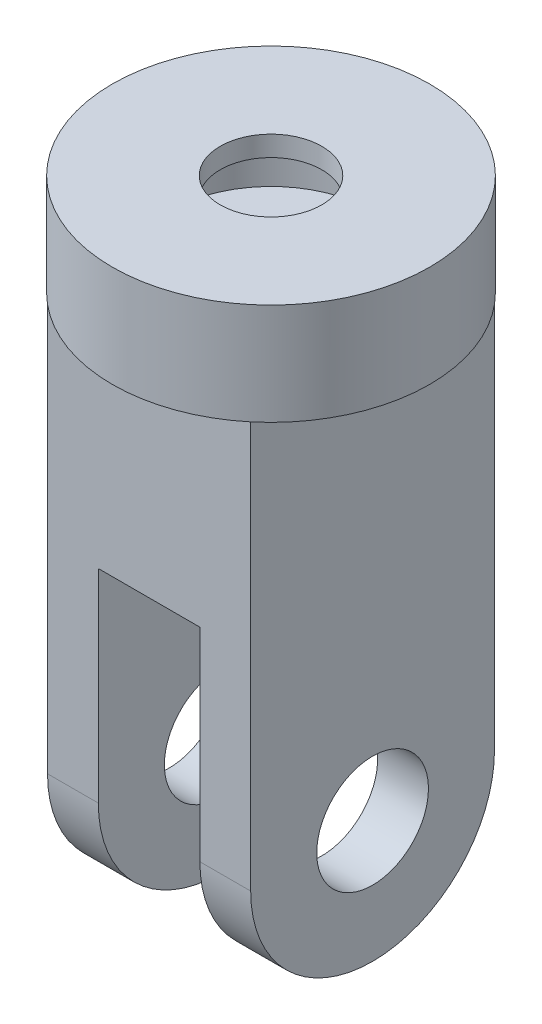
ISO-10303-21;
HEADER;
FILE_DESCRIPTION(('STEP AP214'),'2;1');
FILE_NAME('part.step','',(''),(''),'','','');
FILE_SCHEMA(('AUTOMOTIVE_DESIGN { 1 0 10303 214 1 1 1 1 }'));
ENDSEC;
DATA;
#1=APPLICATION_CONTEXT('core data for automotive mechanical design processes');
#2=APPLICATION_PROTOCOL_DEFINITION('international standard','automotive_design',2000,#1);
#3=PRODUCT_CONTEXT('',#1,'mechanical');
#4=PRODUCT('Part','Part','',(#3));
#5=PRODUCT_RELATED_PRODUCT_CATEGORY('part','',(#4));
#6=PRODUCT_DEFINITION_FORMATION('','',#4);
#7=PRODUCT_DEFINITION_CONTEXT('part definition',#1,'design');
#8=PRODUCT_DEFINITION('design','',#6,#7);
#9=PRODUCT_DEFINITION_SHAPE('','',#8);
#10=(LENGTH_UNIT() NAMED_UNIT(*) SI_UNIT(.MILLI.,.METRE.));
#11=(NAMED_UNIT(*) PLANE_ANGLE_UNIT() SI_UNIT($,.RADIAN.));
#12=(NAMED_UNIT(*) SI_UNIT($,.STERADIAN.) SOLID_ANGLE_UNIT());
#13=UNCERTAINTY_MEASURE_WITH_UNIT(LENGTH_MEASURE(1.E-05),#10,'distance_accuracy_value','');
#14=(GEOMETRIC_REPRESENTATION_CONTEXT(3) GLOBAL_UNCERTAINTY_ASSIGNED_CONTEXT((#13)) GLOBAL_UNIT_ASSIGNED_CONTEXT((#10,
#11,#12)) REPRESENTATION_CONTEXT('',''));
#15=CARTESIAN_POINT('',(0.,0.,0.));
#16=DIRECTION('',(0.,0.,1.));
#17=DIRECTION('',(1.,0.,0.));
#18=AXIS2_PLACEMENT_3D('',#15,#16,#17);
#19=CARTESIAN_POINT('',(10.,0.,0.));
#20=DIRECTION('',(-1.,0.,0.));
#21=DIRECTION('',(0.,0.,1.));
#22=AXIS2_PLACEMENT_3D('',#19,#20,#21);
#23=CYLINDRICAL_SURFACE('',#22,6.);
#24=CARTESIAN_POINT('',(2.5,0.,0.));
#25=DIRECTION('',(1.,0.,0.));
#26=DIRECTION('',(0.,1.,0.));
#27=AXIS2_PLACEMENT_3D('',#24,#25,#26);
#28=CIRCLE('',#27,6.);
#29=CARTESIAN_POINT('',(2.5,0.,6.));
#30=VERTEX_POINT('',#29);
#31=CARTESIAN_POINT('',(2.5,0.,-6.));
#32=VERTEX_POINT('',#31);
#33=EDGE_CURVE('E143',#30,#32,#28,.T.);
#34=ORIENTED_EDGE('',*,*,#33,.F.);
#35=DIRECTION('',(-1.,0.,0.));
#36=VECTOR('',#35,1.);
#37=CARTESIAN_POINT('',(10.,0.,6.));
#38=LINE('',#37,#36);
#39=CARTESIAN_POINT('',(0.,0.,6.));
#40=VERTEX_POINT('',#39);
#41=EDGE_CURVE('E82',#30,#40,#38,.T.);
#42=ORIENTED_EDGE('',*,*,#41,.T.);
#43=CARTESIAN_POINT('',(0.,0.,0.));
#44=DIRECTION('',(1.,0.,0.));
#45=DIRECTION('',(0.,0.,-1.));
#46=AXIS2_PLACEMENT_3D('',#43,#44,#45);
#47=CIRCLE('',#46,6.);
#48=CARTESIAN_POINT('',(0.,0.,-6.));
#49=VERTEX_POINT('',#48);
#50=EDGE_CURVE('E166',#40,#49,#47,.T.);
#51=ORIENTED_EDGE('',*,*,#50,.T.);
#52=DIRECTION('',(-1.,0.,0.));
#53=VECTOR('',#52,1.);
#54=CARTESIAN_POINT('',(10.,0.,-6.));
#55=LINE('',#54,#53);
#56=EDGE_CURVE('E192',#32,#49,#55,.T.);
#57=ORIENTED_EDGE('',*,*,#56,.F.);
#58=EDGE_LOOP('',(#34,#42,#51,#57));
#59=FACE_BOUND('',#58,.T.);
#60=ADVANCED_FACE('F39',(#59),#23,.T.);
#61=CARTESIAN_POINT('',(10.,20.,-6.));
#62=DIRECTION('',(0.,0.,1.));
#63=DIRECTION('',(0.,-1.,0.));
#64=AXIS2_PLACEMENT_3D('',#61,#62,#63);
#65=PLANE('',#64);
#66=DIRECTION('',(0.,1.,0.));
#67=VECTOR('',#66,1.);
#68=CARTESIAN_POINT('',(2.5,20.,-6.));
#69=LINE('',#68,#67);
#70=CARTESIAN_POINT('',(2.5,10.,-6.));
#71=VERTEX_POINT('',#70);
#72=EDGE_CURVE('E121',#32,#71,#69,.T.);
#73=ORIENTED_EDGE('',*,*,#72,.F.);
#74=ORIENTED_EDGE('',*,*,#56,.T.);
#75=DIRECTION('',(0.,1.,0.));
#76=VECTOR('',#75,1.);
#77=CARTESIAN_POINT('',(0.,20.,-6.));
#78=LINE('',#77,#76);
#79=CARTESIAN_POINT('',(0.,20.,-6.));
#80=VERTEX_POINT('',#79);
#81=EDGE_CURVE('E177',#49,#80,#78,.T.);
#82=ORIENTED_EDGE('',*,*,#81,.T.);
#83=DIRECTION('',(-1.,0.,0.));
#84=VECTOR('',#83,1.);
#85=CARTESIAN_POINT('',(10.,20.,-6.));
#86=LINE('',#85,#84);
#87=CARTESIAN_POINT('',(10.,20.,-6.));
#88=VERTEX_POINT('',#87);
#89=EDGE_CURVE('E189',#88,#80,#86,.T.);
#90=ORIENTED_EDGE('',*,*,#89,.F.);
#91=DIRECTION('',(0.,1.,0.));
#92=VECTOR('',#91,1.);
#93=CARTESIAN_POINT('',(10.,20.,-6.));
#94=LINE('',#93,#92);
#95=CARTESIAN_POINT('',(10.,0.,-6.));
#96=VERTEX_POINT('',#95);
#97=EDGE_CURVE('E90',#96,#88,#94,.T.);
#98=ORIENTED_EDGE('',*,*,#97,.F.);
#99=CARTESIAN_POINT('',(7.5,0.,-6.));
#100=VERTEX_POINT('',#99);
#101=EDGE_CURVE('E133',#96,#100,#55,.T.);
#102=ORIENTED_EDGE('',*,*,#101,.T.);
#103=DIRECTION('',(0.,1.,0.));
#104=VECTOR('',#103,1.);
#105=CARTESIAN_POINT('',(7.5,20.,-6.));
#106=LINE('',#105,#104);
#107=CARTESIAN_POINT('',(7.5,10.,-6.));
#108=VERTEX_POINT('',#107);
#109=EDGE_CURVE('E125',#100,#108,#106,.T.);
#110=ORIENTED_EDGE('',*,*,#109,.T.);
#111=DIRECTION('',(-1.,0.,0.));
#112=VECTOR('',#111,1.);
#113=CARTESIAN_POINT('',(10.,10.,-6.));
#114=LINE('',#113,#112);
#115=EDGE_CURVE('E114',#108,#71,#114,.T.);
#116=ORIENTED_EDGE('',*,*,#115,.T.);
#117=EDGE_LOOP('',(#73,#74,#82,#90,#98,#102,#110,#116));
#118=FACE_BOUND('',#117,.T.);
#119=ADVANCED_FACE('F131',(#118),#65,.F.);
#120=CARTESIAN_POINT('',(10.,0.,6.));
#121=DIRECTION('',(0.,0.,-1.));
#122=DIRECTION('',(0.,1.,0.));
#123=AXIS2_PLACEMENT_3D('',#120,#121,#122);
#124=PLANE('',#123);
#125=DIRECTION('',(0.,-1.,0.));
#126=VECTOR('',#125,1.);
#127=CARTESIAN_POINT('',(2.5,0.,6.));
#128=LINE('',#127,#126);
#129=CARTESIAN_POINT('',(2.5,10.,6.));
#130=VERTEX_POINT('',#129);
#131=EDGE_CURVE('E138',#130,#30,#128,.T.);
#132=ORIENTED_EDGE('',*,*,#131,.F.);
#133=DIRECTION('',(1.,0.,0.));
#134=VECTOR('',#133,1.);
#135=CARTESIAN_POINT('',(10.,10.,6.));
#136=LINE('',#135,#134);
#137=CARTESIAN_POINT('',(7.5,10.,6.));
#138=VERTEX_POINT('',#137);
#139=EDGE_CURVE('E11',#130,#138,#136,.T.);
#140=ORIENTED_EDGE('',*,*,#139,.T.);
#141=DIRECTION('',(0.,-1.,0.));
#142=VECTOR('',#141,1.);
#143=CARTESIAN_POINT('',(7.5,0.,6.));
#144=LINE('',#143,#142);
#145=CARTESIAN_POINT('',(7.5,0.,6.));
#146=VERTEX_POINT('',#145);
#147=EDGE_CURVE('E128',#138,#146,#144,.T.);
#148=ORIENTED_EDGE('',*,*,#147,.T.);
#149=CARTESIAN_POINT('',(10.,0.,6.));
#150=VERTEX_POINT('',#149);
#151=EDGE_CURVE('E184',#150,#146,#38,.T.);
#152=ORIENTED_EDGE('',*,*,#151,.F.);
#153=DIRECTION('',(0.,-1.,0.));
#154=VECTOR('',#153,1.);
#155=CARTESIAN_POINT('',(10.,0.,6.));
#156=LINE('',#155,#154);
#157=CARTESIAN_POINT('',(10.,20.,6.));
#158=VERTEX_POINT('',#157);
#159=EDGE_CURVE('E63',#158,#150,#156,.T.);
#160=ORIENTED_EDGE('',*,*,#159,.F.);
#161=DIRECTION('',(-1.,0.,0.));
#162=VECTOR('',#161,1.);
#163=CARTESIAN_POINT('',(10.,20.,6.));
#164=LINE('',#163,#162);
#165=CARTESIAN_POINT('',(0.,20.,6.));
#166=VERTEX_POINT('',#165);
#167=EDGE_CURVE('E187',#158,#166,#164,.T.);
#168=ORIENTED_EDGE('',*,*,#167,.T.);
#169=DIRECTION('',(0.,-1.,0.));
#170=VECTOR('',#169,1.);
#171=CARTESIAN_POINT('',(0.,0.,6.));
#172=LINE('',#171,#170);
#173=EDGE_CURVE('E171',#166,#40,#172,.T.);
#174=ORIENTED_EDGE('',*,*,#173,.T.);
#175=ORIENTED_EDGE('',*,*,#41,.F.);
#176=EDGE_LOOP('',(#132,#140,#148,#152,#160,#168,#174,#175));
#177=FACE_BOUND('',#176,.T.);
#178=ADVANCED_FACE('F202',(#177),#124,.F.);
#179=CARTESIAN_POINT('',(10.,0.,0.));
#180=DIRECTION('',(-1.,0.,0.));
#181=DIRECTION('',(0.,0.,1.));
#182=AXIS2_PLACEMENT_3D('',#179,#180,#181);
#183=CYLINDRICAL_SURFACE('',#182,2.75);
#184=CARTESIAN_POINT('',(0.,0.,0.));
#185=DIRECTION('',(1.,0.,0.));
#186=DIRECTION('',(0.,0.,-1.));
#187=AXIS2_PLACEMENT_3D('',#184,#185,#186);
#188=CIRCLE('',#187,2.75);
#189=CARTESIAN_POINT('',(0.,0.,-2.75));
#190=VERTEX_POINT('',#189);
#191=EDGE_CURVE('E158',#190,#190,#188,.T.);
#192=ORIENTED_EDGE('',*,*,#191,.F.);
#193=EDGE_LOOP('',(#192));
#194=FACE_BOUND('',#193,.T.);
#195=CARTESIAN_POINT('',(2.5,0.,0.));
#196=DIRECTION('',(1.,0.,0.));
#197=DIRECTION('',(0.,1.,0.));
#198=AXIS2_PLACEMENT_3D('',#195,#196,#197);
#199=CIRCLE('',#198,2.75);
#200=CARTESIAN_POINT('',(2.5,2.75,0.));
#201=VERTEX_POINT('',#200);
#202=EDGE_CURVE('E134',#201,#201,#199,.T.);
#203=ORIENTED_EDGE('',*,*,#202,.T.);
#204=EDGE_LOOP('',(#203));
#205=FACE_BOUND('',#204,.T.);
#206=ADVANCED_FACE('F258',(#194,#205),#183,.F.);
#207=CARTESIAN_POINT('',(10.,0.,0.));
#208=DIRECTION('',(1.,0.,0.));
#209=DIRECTION('',(0.,0.,-1.));
#210=AXIS2_PLACEMENT_3D('',#207,#208,#209);
#211=PLANE('',#210);
#212=CARTESIAN_POINT('',(10.,0.,0.));
#213=DIRECTION('',(1.,0.,0.));
#214=DIRECTION('',(0.,0.,-1.));
#215=AXIS2_PLACEMENT_3D('',#212,#213,#214);
#216=CIRCLE('',#215,6.);
#217=EDGE_CURVE('E169',#150,#96,#216,.T.);
#218=ORIENTED_EDGE('',*,*,#217,.T.);
#219=ORIENTED_EDGE('',*,*,#97,.T.);
#220=DIRECTION('',(0.,0.,1.));
#221=VECTOR('',#220,1.);
#222=CARTESIAN_POINT('',(10.,20.,6.));
#223=LINE('',#222,#221);
#224=EDGE_CURVE('E173',#88,#158,#223,.T.);
#225=ORIENTED_EDGE('',*,*,#224,.T.);
#226=ORIENTED_EDGE('',*,*,#159,.T.);
#227=EDGE_LOOP('',(#218,#219,#225,#226));
#228=FACE_BOUND('',#227,.T.);
#229=CARTESIAN_POINT('',(10.,0.,0.));
#230=DIRECTION('',(1.,0.,0.));
#231=DIRECTION('',(0.,0.,-1.));
#232=AXIS2_PLACEMENT_3D('',#229,#230,#231);
#233=CIRCLE('',#232,2.75);
#234=CARTESIAN_POINT('',(10.,0.,-2.75));
#235=VERTEX_POINT('',#234);
#236=EDGE_CURVE('E163',#235,#235,#233,.T.);
#237=ORIENTED_EDGE('',*,*,#236,.F.);
#238=EDGE_LOOP('',(#237));
#239=FACE_BOUND('',#238,.T.);
#240=ADVANCED_FACE('F205',(#228,#239),#211,.T.);
#241=CARTESIAN_POINT('',(0.,0.,0.));
#242=DIRECTION('',(1.,0.,0.));
#243=DIRECTION('',(0.,0.,-1.));
#244=AXIS2_PLACEMENT_3D('',#241,#242,#243);
#245=PLANE('',#244);
#246=ORIENTED_EDGE('',*,*,#50,.F.);
#247=ORIENTED_EDGE('',*,*,#173,.F.);
#248=DIRECTION('',(0.,0.,1.));
#249=VECTOR('',#248,1.);
#250=CARTESIAN_POINT('',(0.,20.,6.));
#251=LINE('',#250,#249);
#252=EDGE_CURVE('E180',#80,#166,#251,.T.);
#253=ORIENTED_EDGE('',*,*,#252,.F.);
#254=ORIENTED_EDGE('',*,*,#81,.F.);
#255=EDGE_LOOP('',(#246,#247,#253,#254));
#256=FACE_BOUND('',#255,.T.);
#257=ORIENTED_EDGE('',*,*,#191,.T.);
#258=EDGE_LOOP('',(#257));
#259=FACE_BOUND('',#258,.T.);
#260=ADVANCED_FACE('F229',(#256,#259),#245,.F.);
#261=ORIENTED_EDGE('',*,*,#151,.T.);
#262=CARTESIAN_POINT('',(7.5,0.,0.));
#263=DIRECTION('',(1.,0.,0.));
#264=DIRECTION('',(0.,1.,0.));
#265=AXIS2_PLACEMENT_3D('',#262,#263,#264);
#266=CIRCLE('',#265,6.);
#267=EDGE_CURVE('E135',#146,#100,#266,.T.);
#268=ORIENTED_EDGE('',*,*,#267,.T.);
#269=ORIENTED_EDGE('',*,*,#101,.F.);
#270=ORIENTED_EDGE('',*,*,#217,.F.);
#271=EDGE_LOOP('',(#261,#268,#269,#270));
#272=FACE_BOUND('',#271,.T.);
#273=ADVANCED_FACE('F41',(#272),#23,.T.);
#274=CARTESIAN_POINT('',(7.5,0.,0.));
#275=DIRECTION('',(1.,0.,0.));
#276=DIRECTION('',(0.,1.,0.));
#277=AXIS2_PLACEMENT_3D('',#274,#275,#276);
#278=CIRCLE('',#277,2.75);
#279=CARTESIAN_POINT('',(7.5,2.75,0.));
#280=VERTEX_POINT('',#279);
#281=EDGE_CURVE('E129',#280,#280,#278,.T.);
#282=ORIENTED_EDGE('',*,*,#281,.F.);
#283=EDGE_LOOP('',(#282));
#284=FACE_BOUND('',#283,.T.);
#285=ORIENTED_EDGE('',*,*,#236,.T.);
#286=EDGE_LOOP('',(#285));
#287=FACE_BOUND('',#286,.T.);
#288=ADVANCED_FACE('F251',(#284,#287),#183,.F.);
#289=CARTESIAN_POINT('',(5.,20.,0.));
#290=DIRECTION('',(0.,1.,0.));
#291=DIRECTION('',(0.,0.,1.));
#292=AXIS2_PLACEMENT_3D('',#289,#290,#291);
#293=PLANE('',#292);
#294=ORIENTED_EDGE('',*,*,#167,.F.);
#295=CARTESIAN_POINT('',(5.,20.,0.));
#296=DIRECTION('',(0.,1.,0.));
#297=DIRECTION('',(0.,0.,1.));
#298=AXIS2_PLACEMENT_3D('',#295,#296,#297);
#299=CIRCLE('',#298,7.81024967590665);
#300=EDGE_CURVE('E154',#166,#158,#299,.T.);
#301=ORIENTED_EDGE('',*,*,#300,.F.);
#302=EDGE_LOOP('',(#294,#301));
#303=FACE_BOUND('',#302,.T.);
#304=ADVANCED_FACE('F225',(#303),#293,.F.);
#305=ORIENTED_EDGE('',*,*,#224,.F.);
#306=EDGE_CURVE('E159',#158,#88,#299,.T.);
#307=ORIENTED_EDGE('',*,*,#306,.F.);
#308=EDGE_LOOP('',(#305,#307));
#309=FACE_BOUND('',#308,.T.);
#310=ADVANCED_FACE('F214',(#309),#293,.F.);
#311=EDGE_CURVE('E219',#80,#166,#299,.T.);
#312=ORIENTED_EDGE('',*,*,#311,.F.);
#313=ORIENTED_EDGE('',*,*,#252,.T.);
#314=EDGE_LOOP('',(#312,#313));
#315=FACE_BOUND('',#314,.T.);
#316=ADVANCED_FACE('F232',(#315),#293,.F.);
#317=CARTESIAN_POINT('',(5.,25.,0.));
#318=DIRECTION('',(0.,-1.,0.));
#319=DIRECTION('',(0.,0.,-1.));
#320=AXIS2_PLACEMENT_3D('',#317,#318,#319);
#321=CYLINDRICAL_SURFACE('',#320,7.81024967590665);
#322=CARTESIAN_POINT('',(5.,25.,0.));
#323=DIRECTION('',(0.,1.,0.));
#324=DIRECTION('',(0.,0.,1.));
#325=AXIS2_PLACEMENT_3D('',#322,#323,#324);
#326=CIRCLE('',#325,7.81024967590665);
#327=CARTESIAN_POINT('',(5.,25.,7.81024967590665));
#328=VERTEX_POINT('',#327);
#329=EDGE_CURVE('E155',#328,#328,#326,.T.);
#330=ORIENTED_EDGE('',*,*,#329,.F.);
#331=EDGE_LOOP('',(#330));
#332=FACE_BOUND('',#331,.T.);
#333=ORIENTED_EDGE('',*,*,#306,.T.);
#334=EDGE_CURVE('E162',#88,#80,#299,.T.);
#335=ORIENTED_EDGE('',*,*,#334,.T.);
#336=ORIENTED_EDGE('',*,*,#311,.T.);
#337=ORIENTED_EDGE('',*,*,#300,.T.);
#338=EDGE_LOOP('',(#333,#335,#336,#337));
#339=FACE_BOUND('',#338,.T.);
#340=ADVANCED_FACE('F221',(#332,#339),#321,.T.);
#341=CARTESIAN_POINT('',(5.,25.,0.));
#342=DIRECTION('',(0.,1.,0.));
#343=DIRECTION('',(0.,0.,1.));
#344=AXIS2_PLACEMENT_3D('',#341,#342,#343);
#345=PLANE('',#344);
#346=ORIENTED_EDGE('',*,*,#329,.T.);
#347=EDGE_LOOP('',(#346));
#348=FACE_BOUND('',#347,.T.);
#349=CARTESIAN_POINT('',(5.,25.,0.));
#350=DIRECTION('',(0.,1.,0.));
#351=DIRECTION('',(0.,0.,1.));
#352=AXIS2_PLACEMENT_3D('',#349,#350,#351);
#353=CIRCLE('',#352,2.5);
#354=CARTESIAN_POINT('',(5.,25.,2.5));
#355=VERTEX_POINT('',#354);
#356=EDGE_CURVE('E120',#355,#355,#353,.T.);
#357=ORIENTED_EDGE('',*,*,#356,.F.);
#358=EDGE_LOOP('',(#357));
#359=FACE_BOUND('',#358,.T.);
#360=ADVANCED_FACE('F239',(#348,#359),#345,.T.);
#361=ORIENTED_EDGE('',*,*,#334,.F.);
#362=ORIENTED_EDGE('',*,*,#89,.T.);
#363=EDGE_LOOP('',(#361,#362));
#364=FACE_BOUND('',#363,.T.);
#365=ADVANCED_FACE('F216',(#364),#293,.F.);
#366=CARTESIAN_POINT('',(5.,24.,0.));
#367=DIRECTION('',(0.,1.,0.));
#368=DIRECTION('',(0.,0.,1.));
#369=AXIS2_PLACEMENT_3D('',#366,#367,#368);
#370=PLANE('',#369);
#371=CARTESIAN_POINT('',(5.,24.,0.));
#372=DIRECTION('',(0.,1.,0.));
#373=DIRECTION('',(0.,0.,1.));
#374=AXIS2_PLACEMENT_3D('',#371,#372,#373);
#375=CIRCLE('',#374,2.5);
#376=CARTESIAN_POINT('',(5.,24.,2.5));
#377=VERTEX_POINT('',#376);
#378=EDGE_CURVE('E146',#377,#377,#375,.T.);
#379=ORIENTED_EDGE('',*,*,#378,.T.);
#380=EDGE_LOOP('',(#379));
#381=FACE_BOUND('',#380,.T.);
#382=CARTESIAN_POINT('',(5.,24.,0.));
#383=DIRECTION('',(0.,1.,0.));
#384=DIRECTION('',(0.,0.,1.));
#385=AXIS2_PLACEMENT_3D('',#382,#383,#384);
#386=CIRCLE('',#385,5.);
#387=CARTESIAN_POINT('',(5.,24.,5.));
#388=VERTEX_POINT('',#387);
#389=EDGE_CURVE('E47',#388,#388,#386,.F.);
#390=ORIENTED_EDGE('',*,*,#389,.T.);
#391=EDGE_LOOP('',(#390));
#392=FACE_BOUND('',#391,.T.);
#393=ADVANCED_FACE('F244',(#381,#392),#370,.F.);
#394=CARTESIAN_POINT('',(5.,24.,0.));
#395=DIRECTION('',(0.,1.,0.));
#396=DIRECTION('',(0.,0.,1.));
#397=AXIS2_PLACEMENT_3D('',#394,#395,#396);
#398=CYLINDRICAL_SURFACE('',#397,2.5);
#399=ORIENTED_EDGE('',*,*,#378,.F.);
#400=EDGE_LOOP('',(#399));
#401=FACE_BOUND('',#400,.T.);
#402=ORIENTED_EDGE('',*,*,#356,.T.);
#403=EDGE_LOOP('',(#402));
#404=FACE_BOUND('',#403,.T.);
#405=ADVANCED_FACE('F290',(#401,#404),#398,.F.);
#406=CARTESIAN_POINT('',(5.,21.,0.));
#407=DIRECTION('',(0.,1.,0.));
#408=DIRECTION('',(0.,0.,1.));
#409=AXIS2_PLACEMENT_3D('',#406,#407,#408);
#410=PLANE('',#409);
#411=CARTESIAN_POINT('',(5.,21.,0.));
#412=DIRECTION('',(0.,1.,0.));
#413=DIRECTION('',(0.,0.,1.));
#414=AXIS2_PLACEMENT_3D('',#411,#412,#413);
#415=CIRCLE('',#414,5.);
#416=CARTESIAN_POINT('',(5.,21.,5.));
#417=VERTEX_POINT('',#416);
#418=EDGE_CURVE('E149',#417,#417,#415,.T.);
#419=ORIENTED_EDGE('',*,*,#418,.T.);
#420=EDGE_LOOP('',(#419));
#421=FACE_BOUND('',#420,.T.);
#422=ADVANCED_FACE('F293',(#421),#410,.T.);
#423=CARTESIAN_POINT('',(5.,21.,0.));
#424=DIRECTION('',(0.,1.,0.));
#425=DIRECTION('',(0.,0.,1.));
#426=AXIS2_PLACEMENT_3D('',#423,#424,#425);
#427=CYLINDRICAL_SURFACE('',#426,5.);
#428=ORIENTED_EDGE('',*,*,#418,.F.);
#429=EDGE_LOOP('',(#428));
#430=FACE_BOUND('',#429,.T.);
#431=ORIENTED_EDGE('',*,*,#389,.F.);
#432=EDGE_LOOP('',(#431));
#433=FACE_BOUND('',#432,.T.);
#434=ADVANCED_FACE('F287',(#430,#433),#427,.F.);
#435=CARTESIAN_POINT('',(2.5,10.,13.));
#436=DIRECTION('',(0.,1.,0.));
#437=DIRECTION('',(0.,0.,1.));
#438=AXIS2_PLACEMENT_3D('',#435,#436,#437);
#439=PLANE('',#438);
#440=DIRECTION('',(0.,0.,-1.));
#441=VECTOR('',#440,1.);
#442=CARTESIAN_POINT('',(7.5,10.,13.));
#443=LINE('',#442,#441);
#444=EDGE_CURVE('E54',#138,#108,#443,.T.);
#445=ORIENTED_EDGE('',*,*,#444,.F.);
#446=ORIENTED_EDGE('',*,*,#139,.F.);
#447=DIRECTION('',(0.,0.,-1.));
#448=VECTOR('',#447,1.);
#449=CARTESIAN_POINT('',(2.5,10.,13.));
#450=LINE('',#449,#448);
#451=EDGE_CURVE('E117',#130,#71,#450,.T.);
#452=ORIENTED_EDGE('',*,*,#451,.T.);
#453=ORIENTED_EDGE('',*,*,#115,.F.);
#454=EDGE_LOOP('',(#445,#446,#452,#453));
#455=FACE_BOUND('',#454,.T.);
#456=ADVANCED_FACE('F115',(#455),#439,.F.);
#457=CARTESIAN_POINT('',(2.5,10.,13.));
#458=DIRECTION('',(1.,0.,0.));
#459=DIRECTION('',(0.,1.,0.));
#460=AXIS2_PLACEMENT_3D('',#457,#458,#459);
#461=PLANE('',#460);
#462=ORIENTED_EDGE('',*,*,#202,.F.);
#463=EDGE_LOOP('',(#462));
#464=FACE_BOUND('',#463,.T.);
#465=ORIENTED_EDGE('',*,*,#72,.T.);
#466=ORIENTED_EDGE('',*,*,#451,.F.);
#467=ORIENTED_EDGE('',*,*,#131,.T.);
#468=ORIENTED_EDGE('',*,*,#33,.T.);
#469=EDGE_LOOP('',(#465,#466,#467,#468));
#470=FACE_BOUND('',#469,.T.);
#471=ADVANCED_FACE('F277',(#464,#470),#461,.T.);
#472=CARTESIAN_POINT('',(7.5,10.,13.));
#473=DIRECTION('',(1.,0.,0.));
#474=DIRECTION('',(0.,1.,0.));
#475=AXIS2_PLACEMENT_3D('',#472,#473,#474);
#476=PLANE('',#475);
#477=ORIENTED_EDGE('',*,*,#281,.T.);
#478=EDGE_LOOP('',(#477));
#479=FACE_BOUND('',#478,.T.);
#480=ORIENTED_EDGE('',*,*,#267,.F.);
#481=ORIENTED_EDGE('',*,*,#147,.F.);
#482=ORIENTED_EDGE('',*,*,#444,.T.);
#483=ORIENTED_EDGE('',*,*,#109,.F.);
#484=EDGE_LOOP('',(#480,#481,#482,#483));
#485=FACE_BOUND('',#484,.T.);
#486=ADVANCED_FACE('F124',(#479,#485),#476,.F.);
#487=CLOSED_SHELL('',(#60,#119,#178,#206,#240,#260,#273,#288,#304,#310,#316,#340,#360,#365,#393,
#405,#422,#434,#456,#471,#486));
#488=MANIFOLD_SOLID_BREP('B2',#487);
#489=ADVANCED_BREP_SHAPE_REPRESENTATION('',(#18,#488),#14);
#490=SHAPE_DEFINITION_REPRESENTATION(#9,#489);
ENDSEC;
END-ISO-10303-21;
